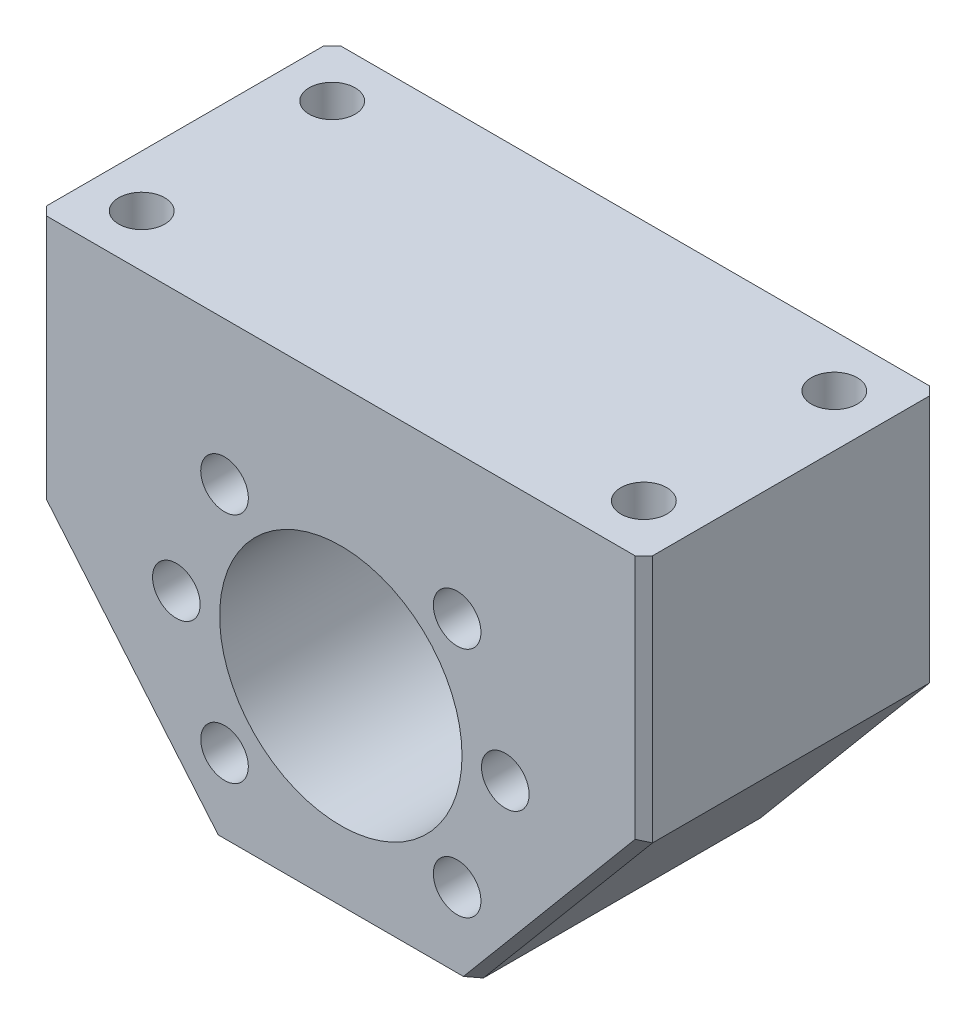
ISO-10303-21;
HEADER;
FILE_DESCRIPTION(('STEP AP214'),'2;1');
FILE_NAME('part.step','',(''),(''),'','','');
FILE_SCHEMA(('AUTOMOTIVE_DESIGN { 1 0 10303 214 1 1 1 1 }'));
ENDSEC;
DATA;
#1=APPLICATION_CONTEXT('core data for automotive mechanical design processes');
#2=APPLICATION_PROTOCOL_DEFINITION('international standard','automotive_design',2000,#1);
#3=PRODUCT_CONTEXT('',#1,'mechanical');
#4=PRODUCT('Part','Part','',(#3));
#5=PRODUCT_RELATED_PRODUCT_CATEGORY('part','',(#4));
#6=PRODUCT_DEFINITION_FORMATION('','',#4);
#7=PRODUCT_DEFINITION_CONTEXT('part definition',#1,'design');
#8=PRODUCT_DEFINITION('design','',#6,#7);
#9=PRODUCT_DEFINITION_SHAPE('','',#8);
#10=(LENGTH_UNIT() NAMED_UNIT(*) SI_UNIT(.MILLI.,.METRE.));
#11=(NAMED_UNIT(*) PLANE_ANGLE_UNIT() SI_UNIT($,.RADIAN.));
#12=(NAMED_UNIT(*) SI_UNIT($,.STERADIAN.) SOLID_ANGLE_UNIT());
#13=UNCERTAINTY_MEASURE_WITH_UNIT(LENGTH_MEASURE(1.E-05),#10,'distance_accuracy_value','');
#14=(GEOMETRIC_REPRESENTATION_CONTEXT(3) GLOBAL_UNCERTAINTY_ASSIGNED_CONTEXT((#13)) GLOBAL_UNIT_ASSIGNED_CONTEXT((#10,
#11,#12)) REPRESENTATION_CONTEXT('',''));
#15=CARTESIAN_POINT('',(0.,0.,0.));
#16=DIRECTION('',(0.,0.,1.));
#17=DIRECTION('',(1.,0.,0.));
#18=AXIS2_PLACEMENT_3D('',#15,#16,#17);
#19=CARTESIAN_POINT('',(0.,0.,17.));
#20=DIRECTION('',(0.,0.,-1.));
#21=DIRECTION('',(-1.,0.,0.));
#22=AXIS2_PLACEMENT_3D('',#19,#20,#21);
#23=PLANE('',#22);
#24=DIRECTION('',(1.,0.,0.));
#25=VECTOR('',#24,1.);
#26=CARTESIAN_POINT('',(15.4667580396378,-22.,17.));
#27=LINE('',#26,#25);
#28=CARTESIAN_POINT('',(-14.1613507503055,-22.,17.));
#29=VERTEX_POINT('',#28);
#30=CARTESIAN_POINT('',(14.1613507503056,-22.,17.));
#31=VERTEX_POINT('',#30);
#32=EDGE_CURVE('E155',#29,#31,#27,.T.);
#33=ORIENTED_EDGE('',*,*,#32,.T.);
#34=DIRECTION('',(0.642787609686538,0.76604444311898,0.));
#35=VECTOR('',#34,1.);
#36=CARTESIAN_POINT('',(19.1431070338335,-16.0629740516768,17.));
#37=LINE('',#36,#35);
#38=CARTESIAN_POINT('',(34.,1.64278151553988,17.));
#39=VERTEX_POINT('',#38);
#40=EDGE_CURVE('E141',#31,#39,#37,.T.);
#41=ORIENTED_EDGE('',*,*,#40,.T.);
#42=DIRECTION('',(0.,1.,0.));
#43=VECTOR('',#42,1.);
#44=CARTESIAN_POINT('',(34.,0.,17.));
#45=LINE('',#44,#43);
#46=CARTESIAN_POINT('',(34.,30.,17.));
#47=VERTEX_POINT('',#46);
#48=EDGE_CURVE('E133',#39,#47,#45,.T.);
#49=ORIENTED_EDGE('',*,*,#48,.T.);
#50=DIRECTION('',(-1.,0.,0.));
#51=VECTOR('',#50,1.);
#52=CARTESIAN_POINT('',(-35.,30.,17.));
#53=LINE('',#52,#51);
#54=CARTESIAN_POINT('',(-34.,30.,17.));
#55=VERTEX_POINT('',#54);
#56=EDGE_CURVE('E138',#47,#55,#53,.T.);
#57=ORIENTED_EDGE('',*,*,#56,.T.);
#58=DIRECTION('',(0.,-1.,0.));
#59=VECTOR('',#58,1.);
#60=CARTESIAN_POINT('',(-34.,0.,17.));
#61=LINE('',#60,#59);
#62=CARTESIAN_POINT('',(-34.,1.64278151553989,17.));
#63=VERTEX_POINT('',#62);
#64=EDGE_CURVE('E145',#55,#63,#61,.T.);
#65=ORIENTED_EDGE('',*,*,#64,.T.);
#66=DIRECTION('',(0.642787609686538,-0.766044443118979,0.));
#67=VECTOR('',#66,1.);
#68=CARTESIAN_POINT('',(-19.1431070338335,-16.0629740516768,17.));
#69=LINE('',#68,#67);
#70=EDGE_CURVE('E202',#63,#29,#69,.T.);
#71=ORIENTED_EDGE('',*,*,#70,.T.);
#72=EDGE_LOOP('',(#33,#41,#49,#57,#65,#71));
#73=FACE_BOUND('',#72,.T.);
#74=CARTESIAN_POINT('',(0.,0.,17.));
#75=DIRECTION('',(0.,0.,1.));
#76=DIRECTION('',(1.,0.,0.));
#77=AXIS2_PLACEMENT_3D('',#74,#75,#76);
#78=CIRCLE('',#77,14.);
#79=CARTESIAN_POINT('',(14.,0.,17.));
#80=VERTEX_POINT('',#79);
#81=EDGE_CURVE('E276',#80,#80,#78,.T.);
#82=ORIENTED_EDGE('',*,*,#81,.F.);
#83=EDGE_LOOP('',(#82));
#84=FACE_BOUND('',#83,.T.);
#85=CARTESIAN_POINT('',(-13.4350288425444,-13.4350288425444,17.));
#86=DIRECTION('',(0.,0.,1.));
#87=DIRECTION('',(1.,0.,0.));
#88=AXIS2_PLACEMENT_3D('',#85,#86,#87);
#89=CIRCLE('',#88,2.75);
#90=CARTESIAN_POINT('',(-10.6850288425444,-13.4350288425444,17.));
#91=VERTEX_POINT('',#90);
#92=EDGE_CURVE('E283',#91,#91,#89,.T.);
#93=ORIENTED_EDGE('',*,*,#92,.F.);
#94=EDGE_LOOP('',(#93));
#95=FACE_BOUND('',#94,.T.);
#96=CARTESIAN_POINT('',(-13.4350288425444,13.4350288425444,17.));
#97=DIRECTION('',(0.,0.,1.));
#98=DIRECTION('',(-1.,0.,0.));
#99=AXIS2_PLACEMENT_3D('',#96,#97,#98);
#100=CIRCLE('',#99,2.74999999999999);
#101=CARTESIAN_POINT('',(-16.1850288425444,13.4350288425444,17.));
#102=VERTEX_POINT('',#101);
#103=EDGE_CURVE('E288',#102,#102,#100,.T.);
#104=ORIENTED_EDGE('',*,*,#103,.F.);
#105=EDGE_LOOP('',(#104));
#106=FACE_BOUND('',#105,.T.);
#107=CARTESIAN_POINT('',(-19.,0.,17.));
#108=DIRECTION('',(0.,0.,1.));
#109=DIRECTION('',(1.,0.,0.));
#110=AXIS2_PLACEMENT_3D('',#107,#108,#109);
#111=CIRCLE('',#110,2.75);
#112=CARTESIAN_POINT('',(-16.25,0.,17.));
#113=VERTEX_POINT('',#112);
#114=EDGE_CURVE('E294',#113,#113,#111,.T.);
#115=ORIENTED_EDGE('',*,*,#114,.F.);
#116=EDGE_LOOP('',(#115));
#117=FACE_BOUND('',#116,.T.);
#118=CARTESIAN_POINT('',(13.4350288425444,13.4350288425444,17.));
#119=DIRECTION('',(0.,0.,1.));
#120=DIRECTION('',(1.,0.,0.));
#121=AXIS2_PLACEMENT_3D('',#118,#119,#120);
#122=CIRCLE('',#121,2.74999999999999);
#123=CARTESIAN_POINT('',(16.1850288425444,13.4350288425444,17.));
#124=VERTEX_POINT('',#123);
#125=EDGE_CURVE('E300',#124,#124,#122,.T.);
#126=ORIENTED_EDGE('',*,*,#125,.F.);
#127=EDGE_LOOP('',(#126));
#128=FACE_BOUND('',#127,.T.);
#129=CARTESIAN_POINT('',(19.,0.,17.));
#130=DIRECTION('',(0.,0.,1.));
#131=DIRECTION('',(-1.,0.,0.));
#132=AXIS2_PLACEMENT_3D('',#129,#130,#131);
#133=CIRCLE('',#132,2.75);
#134=CARTESIAN_POINT('',(16.25,0.,17.));
#135=VERTEX_POINT('',#134);
#136=EDGE_CURVE('E306',#135,#135,#133,.T.);
#137=ORIENTED_EDGE('',*,*,#136,.F.);
#138=EDGE_LOOP('',(#137));
#139=FACE_BOUND('',#138,.T.);
#140=CARTESIAN_POINT('',(13.4350288425444,-13.4350288425444,17.));
#141=DIRECTION('',(0.,0.,1.));
#142=DIRECTION('',(-1.,0.,0.));
#143=AXIS2_PLACEMENT_3D('',#140,#141,#142);
#144=CIRCLE('',#143,2.75);
#145=CARTESIAN_POINT('',(10.6850288425444,-13.4350288425444,17.));
#146=VERTEX_POINT('',#145);
#147=EDGE_CURVE('E312',#146,#146,#144,.T.);
#148=ORIENTED_EDGE('',*,*,#147,.F.);
#149=EDGE_LOOP('',(#148));
#150=FACE_BOUND('',#149,.T.);
#151=ADVANCED_FACE('F40',(#73,#84,#95,#106,#117,#128,#139,#150),#23,.F.);
#152=CARTESIAN_POINT('',(0.,0.,-17.));
#153=DIRECTION('',(0.,0.,-1.));
#154=DIRECTION('',(-1.,0.,0.));
#155=AXIS2_PLACEMENT_3D('',#152,#153,#154);
#156=PLANE('',#155);
#157=CARTESIAN_POINT('',(19.,0.,-17.));
#158=DIRECTION('',(0.,0.,1.));
#159=DIRECTION('',(-1.,0.,0.));
#160=AXIS2_PLACEMENT_3D('',#157,#158,#159);
#161=CIRCLE('',#160,2.75);
#162=CARTESIAN_POINT('',(16.25,0.,-17.));
#163=VERTEX_POINT('',#162);
#164=EDGE_CURVE('E309',#163,#163,#161,.T.);
#165=ORIENTED_EDGE('',*,*,#164,.T.);
#166=EDGE_LOOP('',(#165));
#167=FACE_BOUND('',#166,.T.);
#168=CARTESIAN_POINT('',(-19.,0.,-17.));
#169=DIRECTION('',(0.,0.,1.));
#170=DIRECTION('',(1.,0.,0.));
#171=AXIS2_PLACEMENT_3D('',#168,#169,#170);
#172=CIRCLE('',#171,2.75);
#173=CARTESIAN_POINT('',(-16.25,0.,-17.));
#174=VERTEX_POINT('',#173);
#175=EDGE_CURVE('E297',#174,#174,#172,.T.);
#176=ORIENTED_EDGE('',*,*,#175,.T.);
#177=EDGE_LOOP('',(#176));
#178=FACE_BOUND('',#177,.T.);
#179=CARTESIAN_POINT('',(-13.4350288425444,-13.4350288425444,-17.));
#180=DIRECTION('',(0.,0.,1.));
#181=DIRECTION('',(1.,0.,0.));
#182=AXIS2_PLACEMENT_3D('',#179,#180,#181);
#183=CIRCLE('',#182,2.75);
#184=CARTESIAN_POINT('',(-10.6850288425444,-13.4350288425444,-17.));
#185=VERTEX_POINT('',#184);
#186=EDGE_CURVE('E285',#185,#185,#183,.T.);
#187=ORIENTED_EDGE('',*,*,#186,.T.);
#188=EDGE_LOOP('',(#187));
#189=FACE_BOUND('',#188,.T.);
#190=DIRECTION('',(-1.,0.,0.));
#191=VECTOR('',#190,1.);
#192=CARTESIAN_POINT('',(-35.,30.,-17.));
#193=LINE('',#192,#191);
#194=CARTESIAN_POINT('',(34.,30.,-17.));
#195=VERTEX_POINT('',#194);
#196=CARTESIAN_POINT('',(-34.,30.,-17.));
#197=VERTEX_POINT('',#196);
#198=EDGE_CURVE('E226',#195,#197,#193,.T.);
#199=ORIENTED_EDGE('',*,*,#198,.F.);
#200=DIRECTION('',(0.,-1.,0.));
#201=VECTOR('',#200,1.);
#202=CARTESIAN_POINT('',(34.,1.27881128127369,-17.));
#203=LINE('',#202,#201);
#204=CARTESIAN_POINT('',(34.,1.64278151553989,-17.));
#205=VERTEX_POINT('',#204);
#206=EDGE_CURVE('E177',#195,#205,#203,.T.);
#207=ORIENTED_EDGE('',*,*,#206,.T.);
#208=DIRECTION('',(-0.642787609686538,-0.76604444311898,0.));
#209=VECTOR('',#208,1.);
#210=CARTESIAN_POINT('',(14.7007135965188,-21.3572123903135,-17.));
#211=LINE('',#210,#209);
#212=CARTESIAN_POINT('',(14.1613507503055,-22.,-17.));
#213=VERTEX_POINT('',#212);
#214=EDGE_CURVE('E175',#205,#213,#211,.T.);
#215=ORIENTED_EDGE('',*,*,#214,.T.);
#216=DIRECTION('',(1.,0.,0.));
#217=VECTOR('',#216,1.);
#218=CARTESIAN_POINT('',(15.4667580396378,-22.,-17.));
#219=LINE('',#218,#217);
#220=CARTESIAN_POINT('',(-14.1613507503055,-22.,-17.));
#221=VERTEX_POINT('',#220);
#222=EDGE_CURVE('E156',#221,#213,#219,.T.);
#223=ORIENTED_EDGE('',*,*,#222,.F.);
#224=DIRECTION('',(-0.642787609686538,0.766044443118979,0.));
#225=VECTOR('',#224,1.);
#226=CARTESIAN_POINT('',(-34.233955556881,1.92159889096023,-17.));
#227=LINE('',#226,#225);
#228=CARTESIAN_POINT('',(-34.,1.6427815155399,-17.));
#229=VERTEX_POINT('',#228);
#230=EDGE_CURVE('E173',#221,#229,#227,.T.);
#231=ORIENTED_EDGE('',*,*,#230,.T.);
#232=DIRECTION('',(0.,1.,0.));
#233=VECTOR('',#232,1.);
#234=CARTESIAN_POINT('',(-34.,30.,-17.));
#235=LINE('',#234,#233);
#236=EDGE_CURVE('E171',#229,#197,#235,.T.);
#237=ORIENTED_EDGE('',*,*,#236,.T.);
#238=EDGE_LOOP('',(#199,#207,#215,#223,#231,#237));
#239=FACE_BOUND('',#238,.T.);
#240=CARTESIAN_POINT('',(0.,0.,-17.));
#241=DIRECTION('',(0.,0.,1.));
#242=DIRECTION('',(1.,0.,0.));
#243=AXIS2_PLACEMENT_3D('',#240,#241,#242);
#244=CIRCLE('',#243,14.);
#245=CARTESIAN_POINT('',(14.,0.,-17.));
#246=VERTEX_POINT('',#245);
#247=EDGE_CURVE('E278',#246,#246,#244,.T.);
#248=ORIENTED_EDGE('',*,*,#247,.T.);
#249=EDGE_LOOP('',(#248));
#250=FACE_BOUND('',#249,.T.);
#251=CARTESIAN_POINT('',(-13.4350288425444,13.4350288425444,-17.));
#252=DIRECTION('',(0.,0.,1.));
#253=DIRECTION('',(-1.,0.,0.));
#254=AXIS2_PLACEMENT_3D('',#251,#252,#253);
#255=CIRCLE('',#254,2.74999999999999);
#256=CARTESIAN_POINT('',(-16.1850288425444,13.4350288425444,-17.));
#257=VERTEX_POINT('',#256);
#258=EDGE_CURVE('E291',#257,#257,#255,.T.);
#259=ORIENTED_EDGE('',*,*,#258,.T.);
#260=EDGE_LOOP('',(#259));
#261=FACE_BOUND('',#260,.T.);
#262=CARTESIAN_POINT('',(13.4350288425444,13.4350288425444,-17.));
#263=DIRECTION('',(0.,0.,1.));
#264=DIRECTION('',(1.,0.,0.));
#265=AXIS2_PLACEMENT_3D('',#262,#263,#264);
#266=CIRCLE('',#265,2.74999999999999);
#267=CARTESIAN_POINT('',(16.1850288425444,13.4350288425444,-17.));
#268=VERTEX_POINT('',#267);
#269=EDGE_CURVE('E303',#268,#268,#266,.T.);
#270=ORIENTED_EDGE('',*,*,#269,.T.);
#271=EDGE_LOOP('',(#270));
#272=FACE_BOUND('',#271,.T.);
#273=CARTESIAN_POINT('',(13.4350288425444,-13.4350288425444,-17.));
#274=DIRECTION('',(0.,0.,1.));
#275=DIRECTION('',(-1.,0.,0.));
#276=AXIS2_PLACEMENT_3D('',#273,#274,#275);
#277=CIRCLE('',#276,2.75);
#278=CARTESIAN_POINT('',(10.6850288425444,-13.4350288425444,-17.));
#279=VERTEX_POINT('',#278);
#280=EDGE_CURVE('E315',#279,#279,#277,.T.);
#281=ORIENTED_EDGE('',*,*,#280,.T.);
#282=EDGE_LOOP('',(#281));
#283=FACE_BOUND('',#282,.T.);
#284=ADVANCED_FACE('F260',(#167,#178,#189,#239,#250,#261,#272,#283),#156,.T.);
#285=CARTESIAN_POINT('',(35.,1.27881128127369,17.));
#286=DIRECTION('',(-1.,0.,0.));
#287=DIRECTION('',(0.,-1.,0.));
#288=AXIS2_PLACEMENT_3D('',#285,#286,#287);
#289=PLANE('',#288);
#290=DIRECTION('',(0.,0.,-1.));
#291=VECTOR('',#290,1.);
#292=CARTESIAN_POINT('',(35.,30.,17.));
#293=LINE('',#292,#291);
#294=CARTESIAN_POINT('',(35.,30.,16.));
#295=VERTEX_POINT('',#294);
#296=CARTESIAN_POINT('',(35.,30.,-16.));
#297=VERTEX_POINT('',#296);
#298=EDGE_CURVE('E205',#295,#297,#293,.T.);
#299=ORIENTED_EDGE('',*,*,#298,.F.);
#300=DIRECTION('',(0.,-1.,0.));
#301=VECTOR('',#300,1.);
#302=CARTESIAN_POINT('',(35.,1.27881128127369,16.));
#303=LINE('',#302,#301);
#304=CARTESIAN_POINT('',(35.,1.27881128127369,16.));
#305=VERTEX_POINT('',#304);
#306=EDGE_CURVE('E160',#295,#305,#303,.T.);
#307=ORIENTED_EDGE('',*,*,#306,.T.);
#308=DIRECTION('',(0.,0.,-1.));
#309=VECTOR('',#308,1.);
#310=CARTESIAN_POINT('',(35.,1.27881128127369,17.));
#311=LINE('',#310,#309);
#312=CARTESIAN_POINT('',(35.,1.27881128127369,-16.));
#313=VERTEX_POINT('',#312);
#314=EDGE_CURVE('E246',#305,#313,#311,.T.);
#315=ORIENTED_EDGE('',*,*,#314,.T.);
#316=DIRECTION('',(0.,1.,0.));
#317=VECTOR('',#316,1.);
#318=CARTESIAN_POINT('',(35.,30.,-16.));
#319=LINE('',#318,#317);
#320=EDGE_CURVE('E161',#313,#297,#319,.T.);
#321=ORIENTED_EDGE('',*,*,#320,.T.);
#322=EDGE_LOOP('',(#299,#307,#315,#321));
#323=FACE_BOUND('',#322,.T.);
#324=ADVANCED_FACE('F250',(#323),#289,.F.);
#325=CARTESIAN_POINT('',(-35.,30.,17.));
#326=DIRECTION('',(0.,-1.,0.));
#327=DIRECTION('',(1.,0.,0.));
#328=AXIS2_PLACEMENT_3D('',#325,#326,#327);
#329=PLANE('',#328);
#330=CARTESIAN_POINT('',(29.,30.,-11.));
#331=DIRECTION('',(0.,1.,0.));
#332=DIRECTION('',(-1.,0.,0.));
#333=AXIS2_PLACEMENT_3D('',#330,#331,#332);
#334=CIRCLE('',#333,2.65000000000001);
#335=CARTESIAN_POINT('',(26.35,30.,-11.));
#336=VERTEX_POINT('',#335);
#337=EDGE_CURVE('E186',#336,#336,#334,.T.);
#338=ORIENTED_EDGE('',*,*,#337,.F.);
#339=EDGE_LOOP('',(#338));
#340=FACE_BOUND('',#339,.T.);
#341=CARTESIAN_POINT('',(29.,30.,11.));
#342=DIRECTION('',(0.,1.,0.));
#343=DIRECTION('',(-1.,0.,0.));
#344=AXIS2_PLACEMENT_3D('',#341,#342,#343);
#345=CIRCLE('',#344,2.65000000000001);
#346=CARTESIAN_POINT('',(26.35,30.,11.));
#347=VERTEX_POINT('',#346);
#348=EDGE_CURVE('E332',#347,#347,#345,.T.);
#349=ORIENTED_EDGE('',*,*,#348,.F.);
#350=EDGE_LOOP('',(#349));
#351=FACE_BOUND('',#350,.T.);
#352=CARTESIAN_POINT('',(-29.,30.,11.));
#353=DIRECTION('',(0.,1.,0.));
#354=DIRECTION('',(-1.,0.,0.));
#355=AXIS2_PLACEMENT_3D('',#352,#353,#354);
#356=CIRCLE('',#355,2.65);
#357=CARTESIAN_POINT('',(-31.65,30.,11.));
#358=VERTEX_POINT('',#357);
#359=EDGE_CURVE('E338',#358,#358,#356,.T.);
#360=ORIENTED_EDGE('',*,*,#359,.F.);
#361=EDGE_LOOP('',(#360));
#362=FACE_BOUND('',#361,.T.);
#363=CARTESIAN_POINT('',(-29.,30.,-11.));
#364=DIRECTION('',(0.,1.,0.));
#365=DIRECTION('',(-1.,0.,0.));
#366=AXIS2_PLACEMENT_3D('',#363,#364,#365);
#367=CIRCLE('',#366,2.65);
#368=CARTESIAN_POINT('',(-31.65,30.,-11.));
#369=VERTEX_POINT('',#368);
#370=EDGE_CURVE('E321',#369,#369,#367,.T.);
#371=ORIENTED_EDGE('',*,*,#370,.F.);
#372=EDGE_LOOP('',(#371));
#373=FACE_BOUND('',#372,.T.);
#374=ORIENTED_EDGE('',*,*,#56,.F.);
#375=DIRECTION('',(-0.707106781186543,0.,0.707106781186552));
#376=VECTOR('',#375,1.);
#377=CARTESIAN_POINT('',(34.,30.,17.));
#378=LINE('',#377,#376);
#379=EDGE_CURVE('E150',#47,#295,#378,.F.);
#380=ORIENTED_EDGE('',*,*,#379,.T.);
#381=ORIENTED_EDGE('',*,*,#298,.T.);
#382=DIRECTION('',(-0.707106781186548,0.,-0.707106781186547));
#383=VECTOR('',#382,1.);
#384=CARTESIAN_POINT('',(35.,30.,-16.));
#385=LINE('',#384,#383);
#386=EDGE_CURVE('E162',#297,#195,#385,.T.);
#387=ORIENTED_EDGE('',*,*,#386,.T.);
#388=ORIENTED_EDGE('',*,*,#198,.T.);
#389=DIRECTION('',(-0.707106781186552,0.,0.707106781186543));
#390=VECTOR('',#389,1.);
#391=CARTESIAN_POINT('',(-35.,30.,-16.));
#392=LINE('',#391,#390);
#393=CARTESIAN_POINT('',(-35.,30.,-16.));
#394=VERTEX_POINT('',#393);
#395=EDGE_CURVE('E166',#197,#394,#392,.T.);
#396=ORIENTED_EDGE('',*,*,#395,.T.);
#397=DIRECTION('',(0.,0.,-1.));
#398=VECTOR('',#397,1.);
#399=CARTESIAN_POINT('',(-35.,30.,17.));
#400=LINE('',#399,#398);
#401=CARTESIAN_POINT('',(-35.,30.,16.));
#402=VERTEX_POINT('',#401);
#403=EDGE_CURVE('E224',#402,#394,#400,.T.);
#404=ORIENTED_EDGE('',*,*,#403,.F.);
#405=DIRECTION('',(-0.707106781186548,0.,-0.707106781186548));
#406=VECTOR('',#405,1.);
#407=CARTESIAN_POINT('',(-34.,30.,17.));
#408=LINE('',#407,#406);
#409=EDGE_CURVE('E154',#402,#55,#408,.F.);
#410=ORIENTED_EDGE('',*,*,#409,.T.);
#411=EDGE_LOOP('',(#374,#380,#381,#387,#388,#396,#404,#410));
#412=FACE_BOUND('',#411,.T.);
#413=ADVANCED_FACE('F148',(#340,#351,#362,#373,#412),#329,.F.);
#414=CARTESIAN_POINT('',(-35.,1.27881128127368,17.));
#415=DIRECTION('',(1.,0.,0.));
#416=DIRECTION('',(0.,0.,-1.));
#417=AXIS2_PLACEMENT_3D('',#414,#415,#416);
#418=PLANE('',#417);
#419=ORIENTED_EDGE('',*,*,#403,.T.);
#420=DIRECTION('',(0.,-1.,0.));
#421=VECTOR('',#420,1.);
#422=CARTESIAN_POINT('',(-35.,1.27881128127368,-16.));
#423=LINE('',#422,#421);
#424=CARTESIAN_POINT('',(-35.,1.27881128127368,-16.));
#425=VERTEX_POINT('',#424);
#426=EDGE_CURVE('E11',#394,#425,#423,.T.);
#427=ORIENTED_EDGE('',*,*,#426,.T.);
#428=DIRECTION('',(0.,0.,-1.));
#429=VECTOR('',#428,1.);
#430=CARTESIAN_POINT('',(-35.,1.27881128127368,17.));
#431=LINE('',#430,#429);
#432=CARTESIAN_POINT('',(-35.,1.27881128127368,16.));
#433=VERTEX_POINT('',#432);
#434=EDGE_CURVE('E230',#433,#425,#431,.T.);
#435=ORIENTED_EDGE('',*,*,#434,.F.);
#436=DIRECTION('',(0.,1.,0.));
#437=VECTOR('',#436,1.);
#438=CARTESIAN_POINT('',(-35.,1.27881128127368,16.));
#439=LINE('',#438,#437);
#440=EDGE_CURVE('E50',#433,#402,#439,.T.);
#441=ORIENTED_EDGE('',*,*,#440,.T.);
#442=EDGE_LOOP('',(#419,#427,#435,#441));
#443=FACE_BOUND('',#442,.T.);
#444=ADVANCED_FACE('F229',(#443),#418,.F.);
#445=CARTESIAN_POINT('',(-15.4667580396378,-22.,17.));
#446=DIRECTION('',(0.766044443118979,0.642787609686538,0.));
#447=DIRECTION('',(-0.642787609686538,0.766044443118979,0.));
#448=AXIS2_PLACEMENT_3D('',#445,#446,#447);
#449=PLANE('',#448);
#450=ORIENTED_EDGE('',*,*,#434,.T.);
#451=DIRECTION('',(0.642787609686538,-0.766044443118979,0.));
#452=VECTOR('',#451,1.);
#453=CARTESIAN_POINT('',(-15.4667580396378,-22.,-16.));
#454=LINE('',#453,#452);
#455=CARTESIAN_POINT('',(-15.4667580396378,-22.,-16.));
#456=VERTEX_POINT('',#455);
#457=EDGE_CURVE('E180',#425,#456,#454,.T.);
#458=ORIENTED_EDGE('',*,*,#457,.T.);
#459=DIRECTION('',(0.,0.,-1.));
#460=VECTOR('',#459,1.);
#461=CARTESIAN_POINT('',(-15.4667580396378,-22.,17.));
#462=LINE('',#461,#460);
#463=CARTESIAN_POINT('',(-15.4667580396378,-22.,16.));
#464=VERTEX_POINT('',#463);
#465=EDGE_CURVE('E236',#464,#456,#462,.T.);
#466=ORIENTED_EDGE('',*,*,#465,.F.);
#467=DIRECTION('',(-0.642787609686538,0.766044443118979,0.));
#468=VECTOR('',#467,1.);
#469=CARTESIAN_POINT('',(-15.4667580396378,-22.,16.));
#470=LINE('',#469,#468);
#471=EDGE_CURVE('E63',#464,#433,#470,.T.);
#472=ORIENTED_EDGE('',*,*,#471,.T.);
#473=EDGE_LOOP('',(#450,#458,#466,#472));
#474=FACE_BOUND('',#473,.T.);
#475=ADVANCED_FACE('F235',(#474),#449,.F.);
#476=CARTESIAN_POINT('',(15.4667580396378,-22.,17.));
#477=DIRECTION('',(0.,1.,0.));
#478=DIRECTION('',(-1.,0.,0.));
#479=AXIS2_PLACEMENT_3D('',#476,#477,#478);
#480=PLANE('',#479);
#481=DIRECTION('',(0.,0.,-1.));
#482=VECTOR('',#481,1.);
#483=CARTESIAN_POINT('',(15.4667580396378,-22.,17.));
#484=LINE('',#483,#482);
#485=CARTESIAN_POINT('',(15.4667580396378,-22.,16.));
#486=VERTEX_POINT('',#485);
#487=CARTESIAN_POINT('',(15.4667580396378,-22.,-16.));
#488=VERTEX_POINT('',#487);
#489=EDGE_CURVE('E242',#486,#488,#484,.T.);
#490=ORIENTED_EDGE('',*,*,#489,.F.);
#491=DIRECTION('',(0.79384480609944,0.,-0.60812040241135));
#492=VECTOR('',#491,1.);
#493=CARTESIAN_POINT('',(17.3008016312095,-22.,14.5950410982385));
#494=LINE('',#493,#492);
#495=EDGE_CURVE('E220',#486,#31,#494,.F.);
#496=ORIENTED_EDGE('',*,*,#495,.T.);
#497=ORIENTED_EDGE('',*,*,#32,.F.);
#498=DIRECTION('',(0.793844806099446,0.,0.608120402411342));
#499=VECTOR('',#498,1.);
#500=CARTESIAN_POINT('',(-17.3008016312096,-22.,14.5950410982385));
#501=LINE('',#500,#499);
#502=EDGE_CURVE('E203',#29,#464,#501,.F.);
#503=ORIENTED_EDGE('',*,*,#502,.T.);
#504=ORIENTED_EDGE('',*,*,#465,.T.);
#505=DIRECTION('',(0.793844806099451,0.,-0.608120402411336));
#506=VECTOR('',#505,1.);
#507=CARTESIAN_POINT('',(-15.4667580396378,-22.,-16.));
#508=LINE('',#507,#506);
#509=EDGE_CURVE('E216',#456,#221,#508,.T.);
#510=ORIENTED_EDGE('',*,*,#509,.T.);
#511=ORIENTED_EDGE('',*,*,#222,.T.);
#512=DIRECTION('',(0.793844806099446,0.,0.608120402411342));
#513=VECTOR('',#512,1.);
#514=CARTESIAN_POINT('',(15.4667580396378,-22.,-16.));
#515=LINE('',#514,#513);
#516=EDGE_CURVE('E218',#213,#488,#515,.T.);
#517=ORIENTED_EDGE('',*,*,#516,.T.);
#518=EDGE_LOOP('',(#490,#496,#497,#503,#504,#510,#511,#517));
#519=FACE_BOUND('',#518,.T.);
#520=ADVANCED_FACE('F239',(#519),#480,.F.);
#521=CARTESIAN_POINT('',(15.4667580396378,-22.,17.));
#522=DIRECTION('',(-0.76604444311898,0.642787609686538,0.));
#523=DIRECTION('',(-0.642787609686538,-0.76604444311898,0.));
#524=AXIS2_PLACEMENT_3D('',#521,#522,#523);
#525=PLANE('',#524);
#526=ORIENTED_EDGE('',*,*,#314,.F.);
#527=DIRECTION('',(-0.642787609686538,-0.76604444311898,0.));
#528=VECTOR('',#527,1.);
#529=CARTESIAN_POINT('',(15.4667580396378,-22.,16.));
#530=LINE('',#529,#528);
#531=EDGE_CURVE('E213',#305,#486,#530,.T.);
#532=ORIENTED_EDGE('',*,*,#531,.T.);
#533=ORIENTED_EDGE('',*,*,#489,.T.);
#534=DIRECTION('',(0.642787609686538,0.76604444311898,0.));
#535=VECTOR('',#534,1.);
#536=CARTESIAN_POINT('',(35.,1.27881128127369,-16.));
#537=LINE('',#536,#535);
#538=EDGE_CURVE('E211',#488,#313,#537,.T.);
#539=ORIENTED_EDGE('',*,*,#538,.T.);
#540=EDGE_LOOP('',(#526,#532,#533,#539));
#541=FACE_BOUND('',#540,.T.);
#542=ADVANCED_FACE('F268',(#541),#525,.F.);
#543=CARTESIAN_POINT('',(0.,0.,17.));
#544=DIRECTION('',(0.,0.,-1.));
#545=DIRECTION('',(-1.,0.,0.));
#546=AXIS2_PLACEMENT_3D('',#543,#544,#545);
#547=CYLINDRICAL_SURFACE('',#546,14.);
#548=ORIENTED_EDGE('',*,*,#81,.T.);
#549=EDGE_LOOP('',(#548));
#550=FACE_BOUND('',#549,.T.);
#551=ORIENTED_EDGE('',*,*,#247,.F.);
#552=EDGE_LOOP('',(#551));
#553=FACE_BOUND('',#552,.T.);
#554=ADVANCED_FACE('F382',(#550,#553),#547,.F.);
#555=CARTESIAN_POINT('',(-13.4350288425444,-13.4350288425444,17.));
#556=DIRECTION('',(0.,0.,-1.));
#557=DIRECTION('',(-1.,0.,0.));
#558=AXIS2_PLACEMENT_3D('',#555,#556,#557);
#559=CYLINDRICAL_SURFACE('',#558,2.75);
#560=ORIENTED_EDGE('',*,*,#92,.T.);
#561=EDGE_LOOP('',(#560));
#562=FACE_BOUND('',#561,.T.);
#563=ORIENTED_EDGE('',*,*,#186,.F.);
#564=EDGE_LOOP('',(#563));
#565=FACE_BOUND('',#564,.T.);
#566=ADVANCED_FACE('F553',(#562,#565),#559,.F.);
#567=CARTESIAN_POINT('',(-13.4350288425444,13.4350288425444,17.));
#568=DIRECTION('',(0.,0.,-1.));
#569=DIRECTION('',(-1.,0.,0.));
#570=AXIS2_PLACEMENT_3D('',#567,#568,#569);
#571=CYLINDRICAL_SURFACE('',#570,2.74999999999999);
#572=ORIENTED_EDGE('',*,*,#103,.T.);
#573=EDGE_LOOP('',(#572));
#574=FACE_BOUND('',#573,.T.);
#575=ORIENTED_EDGE('',*,*,#258,.F.);
#576=EDGE_LOOP('',(#575));
#577=FACE_BOUND('',#576,.T.);
#578=ADVANCED_FACE('F543',(#574,#577),#571,.F.);
#579=CARTESIAN_POINT('',(-19.,0.,17.));
#580=DIRECTION('',(0.,0.,-1.));
#581=DIRECTION('',(-1.,0.,0.));
#582=AXIS2_PLACEMENT_3D('',#579,#580,#581);
#583=CYLINDRICAL_SURFACE('',#582,2.75);
#584=ORIENTED_EDGE('',*,*,#114,.T.);
#585=EDGE_LOOP('',(#584));
#586=FACE_BOUND('',#585,.T.);
#587=ORIENTED_EDGE('',*,*,#175,.F.);
#588=EDGE_LOOP('',(#587));
#589=FACE_BOUND('',#588,.T.);
#590=ADVANCED_FACE('F533',(#586,#589),#583,.F.);
#591=CARTESIAN_POINT('',(13.4350288425444,13.4350288425444,17.));
#592=DIRECTION('',(0.,0.,-1.));
#593=DIRECTION('',(-1.,0.,0.));
#594=AXIS2_PLACEMENT_3D('',#591,#592,#593);
#595=CYLINDRICAL_SURFACE('',#594,2.74999999999999);
#596=ORIENTED_EDGE('',*,*,#125,.T.);
#597=EDGE_LOOP('',(#596));
#598=FACE_BOUND('',#597,.T.);
#599=ORIENTED_EDGE('',*,*,#269,.F.);
#600=EDGE_LOOP('',(#599));
#601=FACE_BOUND('',#600,.T.);
#602=ADVANCED_FACE('F523',(#598,#601),#595,.F.);
#603=CARTESIAN_POINT('',(19.,0.,17.));
#604=DIRECTION('',(0.,0.,-1.));
#605=DIRECTION('',(-1.,0.,0.));
#606=AXIS2_PLACEMENT_3D('',#603,#604,#605);
#607=CYLINDRICAL_SURFACE('',#606,2.75);
#608=ORIENTED_EDGE('',*,*,#136,.T.);
#609=EDGE_LOOP('',(#608));
#610=FACE_BOUND('',#609,.T.);
#611=ORIENTED_EDGE('',*,*,#164,.F.);
#612=EDGE_LOOP('',(#611));
#613=FACE_BOUND('',#612,.T.);
#614=ADVANCED_FACE('F370',(#610,#613),#607,.F.);
#615=CARTESIAN_POINT('',(13.4350288425444,-13.4350288425444,17.));
#616=DIRECTION('',(0.,0.,-1.));
#617=DIRECTION('',(-1.,0.,0.));
#618=AXIS2_PLACEMENT_3D('',#615,#616,#617);
#619=CYLINDRICAL_SURFACE('',#618,2.75);
#620=ORIENTED_EDGE('',*,*,#147,.T.);
#621=EDGE_LOOP('',(#620));
#622=FACE_BOUND('',#621,.T.);
#623=ORIENTED_EDGE('',*,*,#280,.F.);
#624=EDGE_LOOP('',(#623));
#625=FACE_BOUND('',#624,.T.);
#626=ADVANCED_FACE('F361',(#622,#625),#619,.F.);
#627=CARTESIAN_POINT('',(-29.,20.,-11.));
#628=DIRECTION('',(0.,1.,0.));
#629=DIRECTION('',(-1.,0.,0.));
#630=AXIS2_PLACEMENT_3D('',#627,#628,#629);
#631=CYLINDRICAL_SURFACE('',#630,2.65);
#632=CARTESIAN_POINT('',(-29.,20.,-11.));
#633=DIRECTION('',(0.,1.,0.));
#634=DIRECTION('',(-1.,0.,0.));
#635=AXIS2_PLACEMENT_3D('',#632,#633,#634);
#636=CIRCLE('',#635,2.65);
#637=CARTESIAN_POINT('',(-31.65,20.,-11.));
#638=VERTEX_POINT('',#637);
#639=EDGE_CURVE('E318',#638,#638,#636,.T.);
#640=ORIENTED_EDGE('',*,*,#639,.F.);
#641=EDGE_LOOP('',(#640));
#642=FACE_BOUND('',#641,.T.);
#643=ORIENTED_EDGE('',*,*,#370,.T.);
#644=EDGE_LOOP('',(#643));
#645=FACE_BOUND('',#644,.T.);
#646=ADVANCED_FACE('F359',(#642,#645),#631,.F.);
#647=CARTESIAN_POINT('',(-29.,20.,-11.));
#648=DIRECTION('',(0.,1.,0.));
#649=DIRECTION('',(-1.,0.,0.));
#650=AXIS2_PLACEMENT_3D('',#647,#648,#649);
#651=PLANE('',#650);
#652=ORIENTED_EDGE('',*,*,#639,.T.);
#653=EDGE_LOOP('',(#652));
#654=FACE_BOUND('',#653,.T.);
#655=ADVANCED_FACE('F349',(#654),#651,.T.);
#656=CARTESIAN_POINT('',(-29.,20.,11.));
#657=DIRECTION('',(0.,1.,0.));
#658=DIRECTION('',(-1.,0.,0.));
#659=AXIS2_PLACEMENT_3D('',#656,#657,#658);
#660=CYLINDRICAL_SURFACE('',#659,2.65);
#661=CARTESIAN_POINT('',(-29.,20.,11.));
#662=DIRECTION('',(0.,1.,0.));
#663=DIRECTION('',(-1.,0.,0.));
#664=AXIS2_PLACEMENT_3D('',#661,#662,#663);
#665=CIRCLE('',#664,2.65);
#666=CARTESIAN_POINT('',(-31.65,20.,11.));
#667=VERTEX_POINT('',#666);
#668=EDGE_CURVE('E324',#667,#667,#665,.T.);
#669=ORIENTED_EDGE('',*,*,#668,.F.);
#670=EDGE_LOOP('',(#669));
#671=FACE_BOUND('',#670,.T.);
#672=ORIENTED_EDGE('',*,*,#359,.T.);
#673=EDGE_LOOP('',(#672));
#674=FACE_BOUND('',#673,.T.);
#675=ADVANCED_FACE('F346',(#671,#674),#660,.F.);
#676=CARTESIAN_POINT('',(-29.,20.,11.));
#677=DIRECTION('',(0.,1.,0.));
#678=DIRECTION('',(-1.,0.,0.));
#679=AXIS2_PLACEMENT_3D('',#676,#677,#678);
#680=PLANE('',#679);
#681=ORIENTED_EDGE('',*,*,#668,.T.);
#682=EDGE_LOOP('',(#681));
#683=FACE_BOUND('',#682,.T.);
#684=ADVANCED_FACE('F344',(#683),#680,.T.);
#685=CARTESIAN_POINT('',(29.,20.,11.));
#686=DIRECTION('',(0.,1.,0.));
#687=DIRECTION('',(-1.,0.,0.));
#688=AXIS2_PLACEMENT_3D('',#685,#686,#687);
#689=CYLINDRICAL_SURFACE('',#688,2.65000000000001);
#690=CARTESIAN_POINT('',(29.,20.,11.));
#691=DIRECTION('',(0.,1.,0.));
#692=DIRECTION('',(-1.,0.,0.));
#693=AXIS2_PLACEMENT_3D('',#690,#691,#692);
#694=CIRCLE('',#693,2.65000000000001);
#695=CARTESIAN_POINT('',(26.35,20.,11.));
#696=VERTEX_POINT('',#695);
#697=EDGE_CURVE('E335',#696,#696,#694,.T.);
#698=ORIENTED_EDGE('',*,*,#697,.F.);
#699=EDGE_LOOP('',(#698));
#700=FACE_BOUND('',#699,.T.);
#701=ORIENTED_EDGE('',*,*,#348,.T.);
#702=EDGE_LOOP('',(#701));
#703=FACE_BOUND('',#702,.T.);
#704=ADVANCED_FACE('F481',(#700,#703),#689,.F.);
#705=CARTESIAN_POINT('',(29.,20.,11.));
#706=DIRECTION('',(0.,1.,0.));
#707=DIRECTION('',(-1.,0.,0.));
#708=AXIS2_PLACEMENT_3D('',#705,#706,#707);
#709=PLANE('',#708);
#710=ORIENTED_EDGE('',*,*,#697,.T.);
#711=EDGE_LOOP('',(#710));
#712=FACE_BOUND('',#711,.T.);
#713=ADVANCED_FACE('F473',(#712),#709,.T.);
#714=CARTESIAN_POINT('',(29.,20.,-11.));
#715=DIRECTION('',(0.,1.,0.));
#716=DIRECTION('',(-1.,0.,0.));
#717=AXIS2_PLACEMENT_3D('',#714,#715,#716);
#718=CYLINDRICAL_SURFACE('',#717,2.65000000000001);
#719=CARTESIAN_POINT('',(29.,20.,-11.));
#720=DIRECTION('',(0.,1.,0.));
#721=DIRECTION('',(-1.,0.,0.));
#722=AXIS2_PLACEMENT_3D('',#719,#720,#721);
#723=CIRCLE('',#722,2.65000000000001);
#724=CARTESIAN_POINT('',(26.35,20.,-11.));
#725=VERTEX_POINT('',#724);
#726=EDGE_CURVE('E329',#725,#725,#723,.T.);
#727=ORIENTED_EDGE('',*,*,#726,.F.);
#728=EDGE_LOOP('',(#727));
#729=FACE_BOUND('',#728,.T.);
#730=ORIENTED_EDGE('',*,*,#337,.T.);
#731=EDGE_LOOP('',(#730));
#732=FACE_BOUND('',#731,.T.);
#733=ADVANCED_FACE('F465',(#729,#732),#718,.F.);
#734=CARTESIAN_POINT('',(29.,20.,-11.));
#735=DIRECTION('',(0.,1.,0.));
#736=DIRECTION('',(-1.,0.,0.));
#737=AXIS2_PLACEMENT_3D('',#734,#735,#736);
#738=PLANE('',#737);
#739=ORIENTED_EDGE('',*,*,#726,.T.);
#740=EDGE_LOOP('',(#739));
#741=FACE_BOUND('',#740,.T.);
#742=ADVANCED_FACE('F406',(#741),#738,.T.);
#743=CARTESIAN_POINT('',(34.,0.,17.));
#744=DIRECTION('',(-0.707106781186552,0.,-0.707106781186543));
#745=DIRECTION('',(0.,1.,0.));
#746=AXIS2_PLACEMENT_3D('',#743,#744,#745);
#747=PLANE('',#746);
#748=ORIENTED_EDGE('',*,*,#379,.F.);
#749=ORIENTED_EDGE('',*,*,#48,.F.);
#750=DIRECTION('',(0.684791078771732,-0.249243569363949,-0.684791078771741));
#751=VECTOR('',#750,1.);
#752=CARTESIAN_POINT('',(34.2803895757366,1.54072805597326,16.7196104242635));
#753=LINE('',#752,#751);
#754=EDGE_CURVE('E184',#305,#39,#753,.F.);
#755=ORIENTED_EDGE('',*,*,#754,.F.);
#756=ORIENTED_EDGE('',*,*,#306,.F.);
#757=EDGE_LOOP('',(#748,#749,#755,#756));
#758=FACE_BOUND('',#757,.T.);
#759=ADVANCED_FACE('F159',(#758),#747,.F.);
#760=CARTESIAN_POINT('',(19.1431070338335,-16.0629740516768,17.));
#761=DIRECTION('',(-0.541675220419707,0.454519477672046,-0.707106781186542));
#762=DIRECTION('',(0.642787609686538,0.76604444311898,0.));
#763=AXIS2_PLACEMENT_3D('',#760,#761,#762);
#764=PLANE('',#763);
#765=ORIENTED_EDGE('',*,*,#495,.F.);
#766=ORIENTED_EDGE('',*,*,#531,.F.);
#767=ORIENTED_EDGE('',*,*,#754,.T.);
#768=ORIENTED_EDGE('',*,*,#40,.F.);
#769=EDGE_LOOP('',(#765,#766,#767,#768));
#770=FACE_BOUND('',#769,.T.);
#771=ADVANCED_FACE('F271',(#770),#764,.F.);
#772=CARTESIAN_POINT('',(15.4667580396378,-22.,-16.));
#773=DIRECTION('',(0.541675220419702,-0.454519477672042,-0.707106781186549));
#774=DIRECTION('',(-0.642787609686538,-0.76604444311898,0.));
#775=AXIS2_PLACEMENT_3D('',#772,#773,#774);
#776=PLANE('',#775);
#777=ORIENTED_EDGE('',*,*,#516,.F.);
#778=ORIENTED_EDGE('',*,*,#214,.F.);
#779=DIRECTION('',(0.684791078771736,-0.249243569363957,0.684791078771735));
#780=VECTOR('',#779,1.);
#781=CARTESIAN_POINT('',(29.8133267529406,3.16660595806817,-21.1866732470594));
#782=LINE('',#781,#780);
#783=EDGE_CURVE('E187',#313,#205,#782,.F.);
#784=ORIENTED_EDGE('',*,*,#783,.F.);
#785=ORIENTED_EDGE('',*,*,#538,.F.);
#786=EDGE_LOOP('',(#777,#778,#784,#785));
#787=FACE_BOUND('',#786,.T.);
#788=ADVANCED_FACE('F264',(#787),#776,.T.);
#789=CARTESIAN_POINT('',(35.,1.27881128127369,-16.));
#790=DIRECTION('',(0.707106781186547,0.,-0.707106781186548));
#791=DIRECTION('',(0.,-1.,0.));
#792=AXIS2_PLACEMENT_3D('',#789,#790,#791);
#793=PLANE('',#792);
#794=ORIENTED_EDGE('',*,*,#783,.T.);
#795=ORIENTED_EDGE('',*,*,#206,.F.);
#796=ORIENTED_EDGE('',*,*,#386,.F.);
#797=ORIENTED_EDGE('',*,*,#320,.F.);
#798=EDGE_LOOP('',(#794,#795,#796,#797));
#799=FACE_BOUND('',#798,.T.);
#800=ADVANCED_FACE('F256',(#799),#793,.T.);
#801=CARTESIAN_POINT('',(-35.,1.27881128127368,-16.));
#802=DIRECTION('',(-0.707106781186542,0.,-0.707106781186552));
#803=DIRECTION('',(0.,1.,0.));
#804=AXIS2_PLACEMENT_3D('',#801,#802,#803);
#805=PLANE('',#804);
#806=ORIENTED_EDGE('',*,*,#395,.F.);
#807=ORIENTED_EDGE('',*,*,#236,.F.);
#808=DIRECTION('',(-0.68479107877174,-0.24924356936396,0.68479107877173));
#809=VECTOR('',#808,1.);
#810=CARTESIAN_POINT('',(-35.,1.27881128127368,-16.));
#811=LINE('',#810,#809);
#812=EDGE_CURVE('E189',#425,#229,#811,.F.);
#813=ORIENTED_EDGE('',*,*,#812,.F.);
#814=ORIENTED_EDGE('',*,*,#426,.F.);
#815=EDGE_LOOP('',(#806,#807,#813,#814));
#816=FACE_BOUND('',#815,.T.);
#817=ADVANCED_FACE('F232',(#816),#805,.T.);
#818=CARTESIAN_POINT('',(-15.4667580396378,-22.,-16.));
#819=DIRECTION('',(-0.541675220419698,-0.454519477672038,-0.707106781186554));
#820=DIRECTION('',(-0.642787609686538,0.766044443118979,0.));
#821=AXIS2_PLACEMENT_3D('',#818,#819,#820);
#822=PLANE('',#821);
#823=ORIENTED_EDGE('',*,*,#812,.T.);
#824=ORIENTED_EDGE('',*,*,#230,.F.);
#825=ORIENTED_EDGE('',*,*,#509,.F.);
#826=ORIENTED_EDGE('',*,*,#457,.F.);
#827=EDGE_LOOP('',(#823,#824,#825,#826));
#828=FACE_BOUND('',#827,.T.);
#829=ADVANCED_FACE('F233',(#828),#822,.T.);
#830=CARTESIAN_POINT('',(-19.1431070338335,-16.0629740516768,17.));
#831=DIRECTION('',(0.541675220419702,0.454519477672042,-0.707106781186549));
#832=DIRECTION('',(0.642787609686538,-0.766044443118979,0.));
#833=AXIS2_PLACEMENT_3D('',#830,#831,#832);
#834=PLANE('',#833);
#835=ORIENTED_EDGE('',*,*,#502,.F.);
#836=ORIENTED_EDGE('',*,*,#70,.F.);
#837=DIRECTION('',(-0.684791078771735,-0.249243569363957,-0.684791078771735));
#838=VECTOR('',#837,1.);
#839=CARTESIAN_POINT('',(-30.0550404567552,3.07862936466542,20.9449595432448));
#840=LINE('',#839,#838);
#841=EDGE_CURVE('E45',#433,#63,#840,.F.);
#842=ORIENTED_EDGE('',*,*,#841,.F.);
#843=ORIENTED_EDGE('',*,*,#471,.F.);
#844=EDGE_LOOP('',(#835,#836,#842,#843));
#845=FACE_BOUND('',#844,.T.);
#846=ADVANCED_FACE('F43',(#845),#834,.F.);
#847=CARTESIAN_POINT('',(-34.,0.,17.));
#848=DIRECTION('',(0.707106781186547,0.,-0.707106781186547));
#849=DIRECTION('',(0.,-1.,0.));
#850=AXIS2_PLACEMENT_3D('',#847,#848,#849);
#851=PLANE('',#850);
#852=ORIENTED_EDGE('',*,*,#409,.F.);
#853=ORIENTED_EDGE('',*,*,#440,.F.);
#854=ORIENTED_EDGE('',*,*,#841,.T.);
#855=ORIENTED_EDGE('',*,*,#64,.F.);
#856=EDGE_LOOP('',(#852,#853,#854,#855));
#857=FACE_BOUND('',#856,.T.);
#858=ADVANCED_FACE('F199',(#857),#851,.F.);
#859=CLOSED_SHELL('',(#151,#284,#324,#413,#444,#475,#520,#542,#554,#566,#578,#590,#602,#614,
#626,#646,#655,#675,#684,#704,#713,#733,#742,#759,#771,#788,#800,#817,#829,#846,#858));
#860=MANIFOLD_SOLID_BREP('B2',#859);
#861=ADVANCED_BREP_SHAPE_REPRESENTATION('',(#18,#860),#14);
#862=SHAPE_DEFINITION_REPRESENTATION(#9,#861);
ENDSEC;
END-ISO-10303-21;
